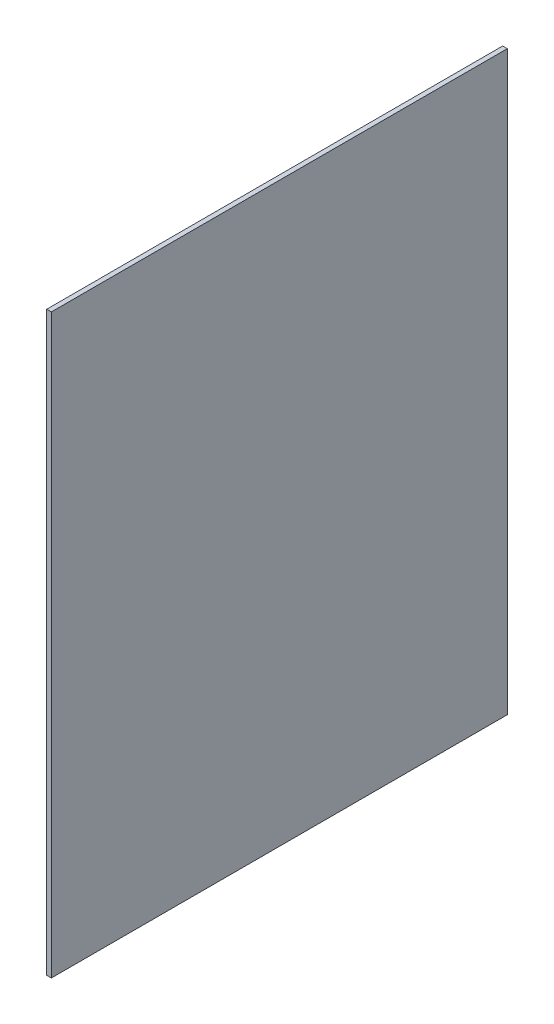
ISO-10303-21;
HEADER;
FILE_DESCRIPTION(('STEP AP214'),'2;1');
FILE_NAME('part.step','',(''),(''),'','','');
FILE_SCHEMA(('AUTOMOTIVE_DESIGN { 1 0 10303 214 1 1 1 1 }'));
ENDSEC;
DATA;
#1=APPLICATION_CONTEXT('core data for automotive mechanical design processes');
#2=APPLICATION_PROTOCOL_DEFINITION('international standard','automotive_design',2000,#1);
#3=PRODUCT_CONTEXT('',#1,'mechanical');
#4=PRODUCT('Part','Part','',(#3));
#5=PRODUCT_RELATED_PRODUCT_CATEGORY('part','',(#4));
#6=PRODUCT_DEFINITION_FORMATION('','',#4);
#7=PRODUCT_DEFINITION_CONTEXT('part definition',#1,'design');
#8=PRODUCT_DEFINITION('design','',#6,#7);
#9=PRODUCT_DEFINITION_SHAPE('','',#8);
#10=(LENGTH_UNIT() NAMED_UNIT(*) SI_UNIT(.MILLI.,.METRE.));
#11=(NAMED_UNIT(*) PLANE_ANGLE_UNIT() SI_UNIT($,.RADIAN.));
#12=(NAMED_UNIT(*) SI_UNIT($,.STERADIAN.) SOLID_ANGLE_UNIT());
#13=UNCERTAINTY_MEASURE_WITH_UNIT(LENGTH_MEASURE(1.E-05),#10,'distance_accuracy_value','');
#14=(GEOMETRIC_REPRESENTATION_CONTEXT(3) GLOBAL_UNCERTAINTY_ASSIGNED_CONTEXT((#13)) GLOBAL_UNIT_ASSIGNED_CONTEXT((#10,
#11,#12)) REPRESENTATION_CONTEXT('',''));
#15=CARTESIAN_POINT('',(0.,0.,0.));
#16=DIRECTION('',(0.,0.,1.));
#17=DIRECTION('',(1.,0.,0.));
#18=AXIS2_PLACEMENT_3D('',#15,#16,#17);
#19=CARTESIAN_POINT('',(6.35,0.,0.));
#20=DIRECTION('',(0.,0.,1.));
#21=DIRECTION('',(1.,0.,0.));
#22=AXIS2_PLACEMENT_3D('',#19,#20,#21);
#23=PLANE('',#22);
#24=DIRECTION('',(0.,1.,0.));
#25=VECTOR('',#24,1.);
#26=CARTESIAN_POINT('',(0.,0.,0.));
#27=LINE('',#26,#25);
#28=CARTESIAN_POINT('',(0.,0.,0.));
#29=VERTEX_POINT('',#28);
#30=CARTESIAN_POINT('',(0.,787.4,0.));
#31=VERTEX_POINT('',#30);
#32=EDGE_CURVE('E104',#29,#31,#27,.T.);
#33=ORIENTED_EDGE('',*,*,#32,.T.);
#34=DIRECTION('',(-1.,0.,0.));
#35=VECTOR('',#34,1.);
#36=CARTESIAN_POINT('',(6.35,787.4,0.));
#37=LINE('',#36,#35);
#38=CARTESIAN_POINT('',(6.35,787.4,0.));
#39=VERTEX_POINT('',#38);
#40=EDGE_CURVE('E11',#39,#31,#37,.T.);
#41=ORIENTED_EDGE('',*,*,#40,.F.);
#42=DIRECTION('',(0.,1.,0.));
#43=VECTOR('',#42,1.);
#44=CARTESIAN_POINT('',(6.35,0.,0.));
#45=LINE('',#44,#43);
#46=CARTESIAN_POINT('',(6.35,0.,0.));
#47=VERTEX_POINT('',#46);
#48=EDGE_CURVE('E92',#47,#39,#45,.T.);
#49=ORIENTED_EDGE('',*,*,#48,.F.);
#50=DIRECTION('',(-1.,0.,0.));
#51=VECTOR('',#50,1.);
#52=CARTESIAN_POINT('',(6.35,0.,0.));
#53=LINE('',#52,#51);
#54=EDGE_CURVE('E100',#47,#29,#53,.T.);
#55=ORIENTED_EDGE('',*,*,#54,.T.);
#56=EDGE_LOOP('',(#33,#41,#49,#55));
#57=FACE_BOUND('',#56,.T.);
#58=ADVANCED_FACE('F41',(#57),#23,.F.);
#59=CARTESIAN_POINT('',(6.35,787.4,0.));
#60=DIRECTION('',(0.,-1.,0.));
#61=DIRECTION('',(0.,0.,-1.));
#62=AXIS2_PLACEMENT_3D('',#59,#60,#61);
#63=PLANE('',#62);
#64=DIRECTION('',(0.,0.,1.));
#65=VECTOR('',#64,1.);
#66=CARTESIAN_POINT('',(0.,787.4,0.));
#67=LINE('',#66,#65);
#68=CARTESIAN_POINT('',(0.,787.4,622.3));
#69=VERTEX_POINT('',#68);
#70=EDGE_CURVE('E96',#31,#69,#67,.T.);
#71=ORIENTED_EDGE('',*,*,#70,.T.);
#72=DIRECTION('',(-1.,0.,0.));
#73=VECTOR('',#72,1.);
#74=CARTESIAN_POINT('',(6.35,787.4,622.3));
#75=LINE('',#74,#73);
#76=CARTESIAN_POINT('',(6.35,787.4,622.3));
#77=VERTEX_POINT('',#76);
#78=EDGE_CURVE('E49',#77,#69,#75,.T.);
#79=ORIENTED_EDGE('',*,*,#78,.F.);
#80=DIRECTION('',(0.,0.,1.));
#81=VECTOR('',#80,1.);
#82=CARTESIAN_POINT('',(6.35,787.4,0.));
#83=LINE('',#82,#81);
#84=EDGE_CURVE('E87',#39,#77,#83,.T.);
#85=ORIENTED_EDGE('',*,*,#84,.F.);
#86=ORIENTED_EDGE('',*,*,#40,.T.);
#87=EDGE_LOOP('',(#71,#79,#85,#86));
#88=FACE_BOUND('',#87,.T.);
#89=ADVANCED_FACE('F95',(#88),#63,.F.);
#90=CARTESIAN_POINT('',(6.35,0.,622.3));
#91=DIRECTION('',(0.,0.,-1.));
#92=DIRECTION('',(-1.,0.,0.));
#93=AXIS2_PLACEMENT_3D('',#90,#91,#92);
#94=PLANE('',#93);
#95=DIRECTION('',(0.,-1.,0.));
#96=VECTOR('',#95,1.);
#97=CARTESIAN_POINT('',(0.,0.,622.3));
#98=LINE('',#97,#96);
#99=CARTESIAN_POINT('',(0.,0.,622.3));
#100=VERTEX_POINT('',#99);
#101=EDGE_CURVE('E74',#69,#100,#98,.T.);
#102=ORIENTED_EDGE('',*,*,#101,.T.);
#103=DIRECTION('',(-1.,0.,0.));
#104=VECTOR('',#103,1.);
#105=CARTESIAN_POINT('',(6.35,0.,622.3));
#106=LINE('',#105,#104);
#107=CARTESIAN_POINT('',(6.35,0.,622.3));
#108=VERTEX_POINT('',#107);
#109=EDGE_CURVE('E97',#108,#100,#106,.T.);
#110=ORIENTED_EDGE('',*,*,#109,.F.);
#111=DIRECTION('',(0.,-1.,0.));
#112=VECTOR('',#111,1.);
#113=CARTESIAN_POINT('',(6.35,0.,622.3));
#114=LINE('',#113,#112);
#115=EDGE_CURVE('E90',#77,#108,#114,.T.);
#116=ORIENTED_EDGE('',*,*,#115,.F.);
#117=ORIENTED_EDGE('',*,*,#78,.T.);
#118=EDGE_LOOP('',(#102,#110,#116,#117));
#119=FACE_BOUND('',#118,.T.);
#120=ADVANCED_FACE('F98',(#119),#94,.F.);
#121=CARTESIAN_POINT('',(6.35,0.,0.));
#122=DIRECTION('',(0.,1.,0.));
#123=DIRECTION('',(0.,0.,1.));
#124=AXIS2_PLACEMENT_3D('',#121,#122,#123);
#125=PLANE('',#124);
#126=DIRECTION('',(0.,0.,-1.));
#127=VECTOR('',#126,1.);
#128=CARTESIAN_POINT('',(0.,0.,0.));
#129=LINE('',#128,#127);
#130=EDGE_CURVE('E80',#100,#29,#129,.T.);
#131=ORIENTED_EDGE('',*,*,#130,.T.);
#132=ORIENTED_EDGE('',*,*,#54,.F.);
#133=DIRECTION('',(0.,0.,-1.));
#134=VECTOR('',#133,1.);
#135=CARTESIAN_POINT('',(6.35,0.,0.));
#136=LINE('',#135,#134);
#137=EDGE_CURVE('E57',#108,#47,#136,.T.);
#138=ORIENTED_EDGE('',*,*,#137,.F.);
#139=ORIENTED_EDGE('',*,*,#109,.T.);
#140=EDGE_LOOP('',(#131,#132,#138,#139));
#141=FACE_BOUND('',#140,.T.);
#142=ADVANCED_FACE('F111',(#141),#125,.F.);
#143=CARTESIAN_POINT('',(6.35,0.,0.));
#144=DIRECTION('',(1.,0.,0.));
#145=DIRECTION('',(0.,0.,-1.));
#146=AXIS2_PLACEMENT_3D('',#143,#144,#145);
#147=PLANE('',#146);
#148=ORIENTED_EDGE('',*,*,#48,.T.);
#149=ORIENTED_EDGE('',*,*,#84,.T.);
#150=ORIENTED_EDGE('',*,*,#115,.T.);
#151=ORIENTED_EDGE('',*,*,#137,.T.);
#152=EDGE_LOOP('',(#148,#149,#150,#151));
#153=FACE_BOUND('',#152,.T.);
#154=ADVANCED_FACE('F88',(#153),#147,.T.);
#155=CARTESIAN_POINT('',(0.,0.,0.));
#156=DIRECTION('',(1.,0.,0.));
#157=DIRECTION('',(0.,0.,-1.));
#158=AXIS2_PLACEMENT_3D('',#155,#156,#157);
#159=PLANE('',#158);
#160=ORIENTED_EDGE('',*,*,#32,.F.);
#161=ORIENTED_EDGE('',*,*,#130,.F.);
#162=ORIENTED_EDGE('',*,*,#101,.F.);
#163=ORIENTED_EDGE('',*,*,#70,.F.);
#164=EDGE_LOOP('',(#160,#161,#162,#163));
#165=FACE_BOUND('',#164,.T.);
#166=ADVANCED_FACE('F114',(#165),#159,.F.);
#167=CLOSED_SHELL('',(#58,#89,#120,#142,#154,#166));
#168=MANIFOLD_SOLID_BREP('B2',#167);
#169=ADVANCED_BREP_SHAPE_REPRESENTATION('',(#18,#168),#14);
#170=SHAPE_DEFINITION_REPRESENTATION(#9,#169);
ENDSEC;
END-ISO-10303-21;
